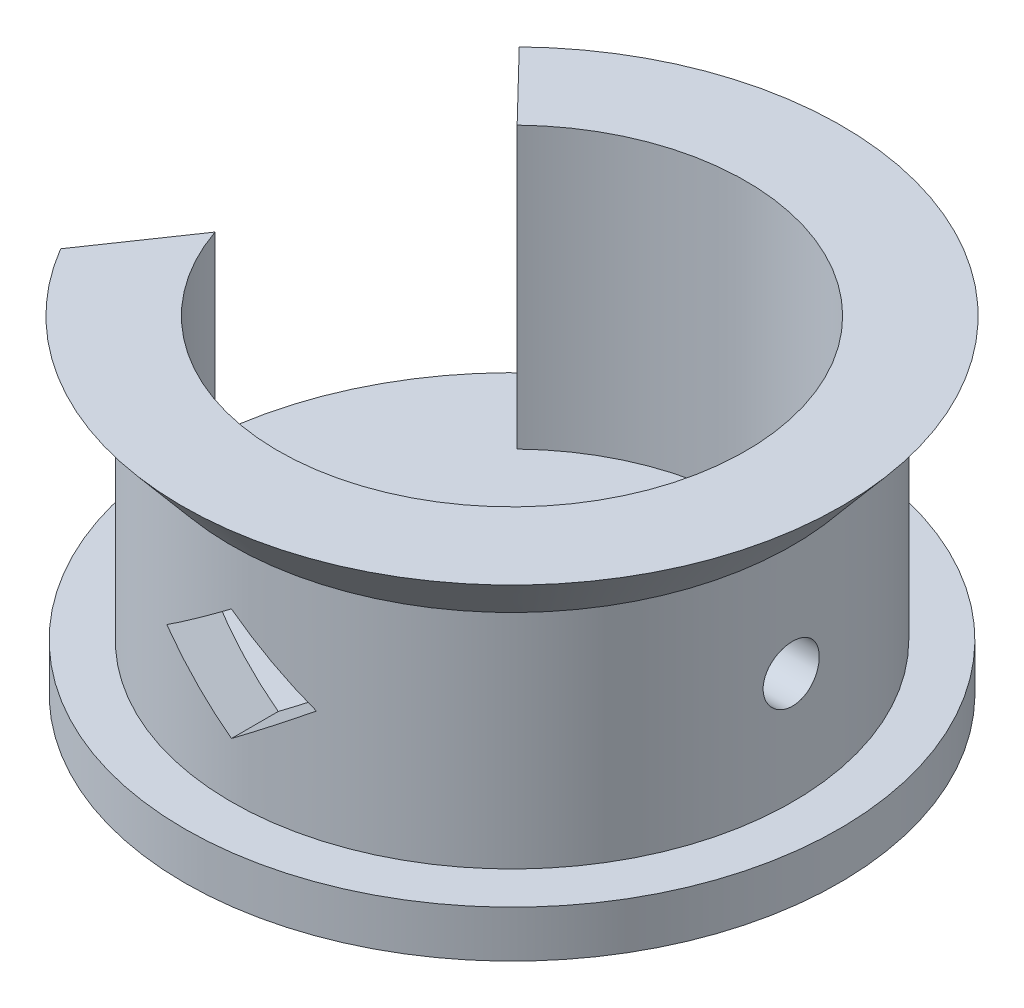
ISO-10303-21;
HEADER;
FILE_DESCRIPTION(('STEP AP214'),'2;1');
FILE_NAME('part.step','',(''),(''),'','','');
FILE_SCHEMA(('AUTOMOTIVE_DESIGN { 1 0 10303 214 1 1 1 1 }'));
ENDSEC;
DATA;
#1=APPLICATION_CONTEXT('core data for automotive mechanical design processes');
#2=APPLICATION_PROTOCOL_DEFINITION('international standard','automotive_design',2000,#1);
#3=PRODUCT_CONTEXT('',#1,'mechanical');
#4=PRODUCT('Part','Part','',(#3));
#5=PRODUCT_RELATED_PRODUCT_CATEGORY('part','',(#4));
#6=PRODUCT_DEFINITION_FORMATION('','',#4);
#7=PRODUCT_DEFINITION_CONTEXT('part definition',#1,'design');
#8=PRODUCT_DEFINITION('design','',#6,#7);
#9=PRODUCT_DEFINITION_SHAPE('','',#8);
#10=(LENGTH_UNIT() NAMED_UNIT(*) SI_UNIT(.MILLI.,.METRE.));
#11=(NAMED_UNIT(*) PLANE_ANGLE_UNIT() SI_UNIT($,.RADIAN.));
#12=(NAMED_UNIT(*) SI_UNIT($,.STERADIAN.) SOLID_ANGLE_UNIT());
#13=UNCERTAINTY_MEASURE_WITH_UNIT(LENGTH_MEASURE(1.E-05),#10,'distance_accuracy_value','');
#14=(GEOMETRIC_REPRESENTATION_CONTEXT(3) GLOBAL_UNCERTAINTY_ASSIGNED_CONTEXT((#13)) GLOBAL_UNIT_ASSIGNED_CONTEXT((#10,
#11,#12)) REPRESENTATION_CONTEXT('',''));
#15=CARTESIAN_POINT('',(0.,0.,0.));
#16=DIRECTION('',(0.,0.,1.));
#17=DIRECTION('',(1.,0.,0.));
#18=AXIS2_PLACEMENT_3D('',#15,#16,#17);
#19=CARTESIAN_POINT('',(0.,5.75,0.));
#20=DIRECTION('',(0.,-1.,0.));
#21=DIRECTION('',(0.,0.,-1.));
#22=AXIS2_PLACEMENT_3D('',#19,#20,#21);
#23=CYLINDRICAL_SURFACE('',#22,6.);
#24=CARTESIAN_POINT('',(0.,2.175,0.));
#25=DIRECTION('',(0.6,0.8,0.));
#26=DIRECTION('',(0.8,-0.6,0.));
#27=AXIS2_PLACEMENT_3D('',#24,#25,#26);
#28=ELLIPSE('',#27,7.5,6.);
#29=CARTESIAN_POINT('',(-1.6,3.375,5.78273291792039));
#30=VERTEX_POINT('',#29);
#31=CARTESIAN_POINT('',(0.,2.175,6.));
#32=VERTEX_POINT('',#31);
#33=EDGE_CURVE('E169',#30,#32,#28,.T.);
#34=ORIENTED_EDGE('',*,*,#33,.F.);
#35=CARTESIAN_POINT('',(0.,4.575,0.));
#36=DIRECTION('',(-0.6,0.8,0.));
#37=DIRECTION('',(-0.8,-0.6,0.));
#38=AXIS2_PLACEMENT_3D('',#35,#36,#37);
#39=ELLIPSE('',#38,7.5,6.);
#40=CARTESIAN_POINT('',(0.,4.575,6.));
#41=VERTEX_POINT('',#40);
#42=EDGE_CURVE('E150',#30,#41,#39,.T.);
#43=ORIENTED_EDGE('',*,*,#42,.T.);
#44=CARTESIAN_POINT('',(0.,4.575,0.));
#45=DIRECTION('',(0.6,0.8,0.));
#46=DIRECTION('',(0.8,-0.6,0.));
#47=AXIS2_PLACEMENT_3D('',#44,#45,#46);
#48=ELLIPSE('',#47,7.5,6.);
#49=CARTESIAN_POINT('',(1.6,3.375,5.78273291792039));
#50=VERTEX_POINT('',#49);
#51=EDGE_CURVE('E156',#41,#50,#48,.T.);
#52=ORIENTED_EDGE('',*,*,#51,.T.);
#53=CARTESIAN_POINT('',(0.,2.175,0.));
#54=DIRECTION('',(-0.6,0.8,0.));
#55=DIRECTION('',(-0.8,-0.6,0.));
#56=AXIS2_PLACEMENT_3D('',#53,#54,#55);
#57=ELLIPSE('',#56,7.5,6.);
#58=EDGE_CURVE('E166',#32,#50,#57,.T.);
#59=ORIENTED_EDGE('',*,*,#58,.F.);
#60=EDGE_LOOP('',(#34,#43,#52,#59));
#61=FACE_BOUND('',#60,.T.);
#62=DIRECTION('',(0.,-1.,0.));
#63=VECTOR('',#62,1.);
#64=CARTESIAN_POINT('',(-5.40419060518485,5.75,2.60666912032038));
#65=LINE('',#64,#63);
#66=CARTESIAN_POINT('',(-5.40419060518485,1.,2.60666912032038));
#67=VERTEX_POINT('',#66);
#68=CARTESIAN_POINT('',(-5.40419060518485,5.75,2.60666912032038));
#69=VERTEX_POINT('',#68);
#70=EDGE_CURVE('E245',#67,#69,#65,.F.);
#71=ORIENTED_EDGE('',*,*,#70,.F.);
#72=CARTESIAN_POINT('',(0.,1.,0.));
#73=DIRECTION('',(0.,1.,0.));
#74=DIRECTION('',(0.,0.,1.));
#75=AXIS2_PLACEMENT_3D('',#72,#73,#74);
#76=CIRCLE('',#75,6.);
#77=CARTESIAN_POINT('',(-4.17641886951736,1.,-4.30784463813858));
#78=VERTEX_POINT('',#77);
#79=EDGE_CURVE('E283',#67,#78,#76,.T.);
#80=ORIENTED_EDGE('',*,*,#79,.T.);
#81=DIRECTION('',(0.,-1.,0.));
#82=VECTOR('',#81,1.);
#83=CARTESIAN_POINT('',(-4.17641886951736,5.75,-4.30784463813858));
#84=LINE('',#83,#82);
#85=CARTESIAN_POINT('',(-4.17641886951736,5.75,-4.30784463813858));
#86=VERTEX_POINT('',#85);
#87=EDGE_CURVE('E125',#78,#86,#84,.F.);
#88=ORIENTED_EDGE('',*,*,#87,.T.);
#89=CARTESIAN_POINT('',(0.,5.75,0.));
#90=DIRECTION('',(0.,1.,0.));
#91=DIRECTION('',(0.,0.,1.));
#92=AXIS2_PLACEMENT_3D('',#89,#90,#91);
#93=CIRCLE('',#92,6.);
#94=EDGE_CURVE('E172',#69,#86,#93,.T.);
#95=ORIENTED_EDGE('',*,*,#94,.F.);
#96=EDGE_LOOP('',(#71,#80,#88,#95));
#97=FACE_BOUND('',#96,.T.);
#98=CARTESIAN_POINT('',(5.96992462263972,3.375,0.6));
#99=CARTESIAN_POINT('',(5.96992501678142,3.34138826149584,0.599998544036107));
#100=CARTESIAN_POINT('',(5.97021154196531,3.3077542989529,0.597166115389485));
#101=CARTESIAN_POINT('',(5.97132652534872,3.24141888822388,0.585909788858137));
#102=CARTESIAN_POINT('',(5.97215558076732,3.20871850917751,0.577479728931861));
#103=CARTESIAN_POINT('',(5.97426079828433,3.14522050846926,0.555276069641356));
#104=CARTESIAN_POINT('',(5.97553668928074,3.11442174636514,0.541505709776339));
#105=CARTESIAN_POINT('',(5.97839148343092,3.05557932462495,0.50901856043466));
#106=CARTESIAN_POINT('',(5.97997032638597,3.02753511930977,0.490302753375555));
#107=CARTESIAN_POINT('',(5.98325956025939,2.9748892418055,0.448382857199222));
#108=CARTESIAN_POINT('',(5.9849703600316,2.95029899429773,0.425164450864955));
#109=CARTESIAN_POINT('',(5.98832703141431,2.90535743459786,0.374929029191738));
#110=CARTESIAN_POINT('',(5.98997290005128,2.88500631635621,0.347911840143941));
#111=CARTESIAN_POINT('',(5.99301829893363,2.84908124579571,0.290775816990592));
#112=CARTESIAN_POINT('',(5.99441730536788,2.8335174007238,0.260650597517741));
#113=CARTESIAN_POINT('',(5.99680690125462,2.80767334011079,0.198197990572506));
#114=CARTESIAN_POINT('',(5.99779750066238,2.79739299577832,0.165870656800931));
#115=CARTESIAN_POINT('',(5.99925579942616,2.78244125438805,0.100046869645769));
#116=CARTESIAN_POINT('',(5.9997252470569,2.77775110035003,0.0665547162189482));
#117=CARTESIAN_POINT('',(6.00009429359215,2.77405483851977,-0.000744444413366362));
#118=CARTESIAN_POINT('',(5.99999390727164,2.77504858335224,-0.0345514434326772));
#119=CARTESIAN_POINT('',(5.99923602786711,2.78267668359009,-0.101393306438736));
#120=CARTESIAN_POINT('',(5.99858052691028,2.78929086933833,-0.134430497960988));
#121=CARTESIAN_POINT('',(5.99678837558958,2.80794067736797,-0.19892350770272));
#122=CARTESIAN_POINT('',(5.99565171897572,2.81997637007254,-0.230379305374637));
#123=CARTESIAN_POINT('',(5.99302162490349,2.84914965795266,-0.290880188807752));
#124=CARTESIAN_POINT('',(5.99152756419455,2.86629617851809,-0.31992094258899));
#125=CARTESIAN_POINT('',(5.98835030711644,2.90519791400182,-0.374720107904516));
#126=CARTESIAN_POINT('',(5.98666710520087,2.92695326408711,-0.400478423136497));
#127=CARTESIAN_POINT('',(5.98329176080711,2.97456853770819,-0.448099663093614));
#128=CARTESIAN_POINT('',(5.98159961143817,3.00044600684495,-0.469945047714207));
#129=CARTESIAN_POINT('',(5.97840443956933,3.05551011912647,-0.508984521214751));
#130=CARTESIAN_POINT('',(5.97690141734379,3.08469676707129,-0.526178603347734));
#131=CARTESIAN_POINT('',(5.9742545370849,3.14556421511988,-0.555427310743938));
#132=CARTESIAN_POINT('',(5.97311075479533,3.17724553945373,-0.567480852343776));
#133=CARTESIAN_POINT('',(5.97131341122563,3.24219636276881,-0.586092441382554));
#134=CARTESIAN_POINT('',(5.97065983501061,3.27546581333247,-0.59265065624582));
#135=CARTESIAN_POINT('',(5.9699194831645,3.34249450771771,-0.600062865235176));
#136=CARTESIAN_POINT('',(5.96983026928562,3.3762510121589,-0.600941397988327));
#137=CARTESIAN_POINT('',(5.97022230812863,3.44343075949372,-0.597033748122817));
#138=CARTESIAN_POINT('',(5.97070355314237,3.47685400688422,-0.592247642045852));
#139=CARTESIAN_POINT('',(5.97218006653441,3.54234694936701,-0.577167104704512));
#140=CARTESIAN_POINT('',(5.97317425200807,3.5744193426568,-0.566884276313345));
#141=CARTESIAN_POINT('',(5.97556374623277,3.63638403103818,-0.541114031805564));
#142=CARTESIAN_POINT('',(5.97695906417202,3.66627627617231,-0.525626496470153));
#143=CARTESIAN_POINT('',(5.97999950613428,3.72314398441727,-0.48982500085393));
#144=CARTESIAN_POINT('',(5.98164546488803,3.75010916517975,-0.469494779904414));
#145=CARTESIAN_POINT('',(5.98499899575112,3.80025303196444,-0.424608320070704));
#146=CARTESIAN_POINT('',(5.9867065693852,3.82343162420405,-0.400051976548881));
#147=CARTESIAN_POINT('',(5.98999828709581,3.86542898003886,-0.347303882535884));
#148=CARTESIAN_POINT('',(5.99158196433285,3.88423173575173,-0.319099353581671));
#149=CARTESIAN_POINT('',(5.99444065263978,3.91683352110385,-0.259918630450278));
#150=CARTESIAN_POINT('',(5.99571566793895,3.93063261930426,-0.228942474257775));
#151=CARTESIAN_POINT('',(5.99781126248403,3.9528082605932,-0.165153675859689));
#152=CARTESIAN_POINT('',(5.99863265163389,3.96119447239513,-0.132344422589975));
#153=CARTESIAN_POINT('',(5.99973176768189,3.97233784174791,-0.0657748883902072));
#154=CARTESIAN_POINT('',(6.00000950985938,3.97509515750042,-0.0320146342153302));
#155=CARTESIAN_POINT('',(5.99999002987962,3.97490024013603,0.0353413344454483));
#156=CARTESIAN_POINT('',(5.99969531026002,3.97197285789801,0.0689371243347171));
#157=CARTESIAN_POINT('',(5.99856896146555,3.96054375260581,0.135157133013818));
#158=CARTESIAN_POINT('',(5.99773733186924,3.95204202517622,0.16778135104102));
#159=CARTESIAN_POINT('',(5.99563034288377,3.92971244556424,0.231131945260646));
#160=CARTESIAN_POINT('',(5.99435504401949,3.9158853198395,0.261858579646517));
#161=CARTESIAN_POINT('',(5.99150287449778,3.88330009864981,0.320558760092878));
#162=CARTESIAN_POINT('',(5.98992600560493,3.86454203203733,0.348532322261136));
#163=CARTESIAN_POINT('',(5.98663910801433,3.82253422858575,0.401059634656163));
#164=CARTESIAN_POINT('',(5.9849285487642,3.79926599025312,0.425598555731604));
#165=CARTESIAN_POINT('',(5.98157154461795,3.74893478907273,0.470434655635885));
#166=CARTESIAN_POINT('',(5.97992511520666,3.72187091689855,0.490730815108709));
#167=CARTESIAN_POINT('',(5.97687830046361,3.66464139484805,0.526545984254432));
#168=CARTESIAN_POINT('',(5.97547855155184,3.63446803120557,0.542052712796901));
#169=CARTESIAN_POINT('',(5.97309116857477,3.57195102525226,0.567758824859261));
#170=CARTESIAN_POINT('',(5.97210306992016,3.53960987764457,0.577964194733915));
#171=CARTESIAN_POINT('',(5.97090004522887,3.48507135546053,0.590233013000118));
#172=CARTESIAN_POINT('',(5.97053599161417,3.46322264921614,0.593890627438935));
#173=CARTESIAN_POINT('',(5.97004815106598,3.41925250617447,0.598774595163068));
#174=CARTESIAN_POINT('',(5.96992436312391,3.39713107052244,0.600000958654358));
#175=CARTESIAN_POINT('',(5.96992462263972,3.375,0.6));
#176=B_SPLINE_CURVE_WITH_KNOTS('',3,(#98,#99,#100,#101,#102,#103,#104,#105,#106,#107,#108,#109,
#110,#111,#112,#113,#114,#115,#116,#117,#118,#119,#120,#121,#122,#123,#124,#125,#126,#127,#128,
#129,#130,#131,#132,#133,#134,#135,#136,#137,#138,#139,#140,#141,#142,#143,#144,#145,#146,#147,
#148,#149,#150,#151,#152,#153,#154,#155,#156,#157,#158,#159,#160,#161,#162,#163,#164,#165,#166,
#167,#168,#169,#170,#171,#172,#173,#174,#175),.UNSPECIFIED.,.T.,.F.,(4,2,2,2,2,2,2,2,2,2,2,2,2,
2,2,2,2,2,2,2,2,2,2,2,2,2,2,2,2,2,2,2,2,2,2,2,2,2,4),(0.,0.100754396661877,0.201619891093062,
0.302424294598484,0.403208688252789,0.504318969179551,0.605433875131518,0.70676081982775,
0.808085294446769,0.909068825390698,1.01004973798939,1.11066979091197,1.21129115088585,
1.31208927279848,1.41289035131117,1.51413255051001,1.61537489656538,1.7166385747076,
1.8178991675702,1.91872197784659,2.01954342580122,2.12015288822716,2.22076465536628,
2.32171913887031,2.42267612233922,2.52399682090871,2.62531613110803,2.72645395616617,
2.82758893867889,2.9282828008109,3.02897674197995,3.12965695197148,3.23033657286479,
3.33143829022793,3.43256427020715,3.53394744642286,3.635215889364,3.70155616563628,
3.76789616342289),.UNSPECIFIED.);
#177=CARTESIAN_POINT('',(5.96992462263972,3.375,0.6));
#178=VERTEX_POINT('',#177);
#179=EDGE_CURVE('E227',#178,#178,#176,.T.);
#180=ORIENTED_EDGE('',*,*,#179,.F.);
#181=EDGE_LOOP('',(#180));
#182=FACE_BOUND('',#181,.T.);
#183=ADVANCED_FACE('F45',(#61,#97,#182),#23,.T.);
#184=CARTESIAN_POINT('',(0.,5.75,0.));
#185=DIRECTION('',(0.,-1.,0.));
#186=DIRECTION('',(0.,0.,-1.));
#187=AXIS2_PLACEMENT_3D('',#184,#185,#186);
#188=CYLINDRICAL_SURFACE('',#187,5.);
#189=CARTESIAN_POINT('',(0.,1.,0.));
#190=DIRECTION('',(0.,1.,0.));
#191=DIRECTION('',(0.,0.,1.));
#192=AXIS2_PLACEMENT_3D('',#189,#190,#191);
#193=CIRCLE('',#192,5.);
#194=CARTESIAN_POINT('',(-3.48034905793113,1.,-3.58987053178215));
#195=VERTEX_POINT('',#194);
#196=CARTESIAN_POINT('',(-4.73004533541473,1.,1.62070081289587));
#197=VERTEX_POINT('',#196);
#198=EDGE_CURVE('E140',#195,#197,#193,.F.);
#199=ORIENTED_EDGE('',*,*,#198,.T.);
#200=DIRECTION('',(0.,1.,0.));
#201=VECTOR('',#200,1.);
#202=CARTESIAN_POINT('',(-4.73004533541473,1.,1.62070081289587));
#203=LINE('',#202,#201);
#204=CARTESIAN_POINT('',(-4.73004533541473,7.,1.62070081289587));
#205=VERTEX_POINT('',#204);
#206=EDGE_CURVE('E144',#197,#205,#203,.T.);
#207=ORIENTED_EDGE('',*,*,#206,.T.);
#208=CARTESIAN_POINT('',(0.,7.,0.));
#209=DIRECTION('',(0.,1.,0.));
#210=DIRECTION('',(0.,0.,1.));
#211=AXIS2_PLACEMENT_3D('',#208,#209,#210);
#212=CIRCLE('',#211,5.);
#213=CARTESIAN_POINT('',(-3.48034905793113,7.,-3.58987053178215));
#214=VERTEX_POINT('',#213);
#215=EDGE_CURVE('E142',#205,#214,#212,.T.);
#216=ORIENTED_EDGE('',*,*,#215,.T.);
#217=DIRECTION('',(0.,1.,0.));
#218=VECTOR('',#217,1.);
#219=CARTESIAN_POINT('',(-3.48034905793113,1.,-3.58987053178215));
#220=LINE('',#219,#218);
#221=EDGE_CURVE('E123',#195,#214,#220,.T.);
#222=ORIENTED_EDGE('',*,*,#221,.F.);
#223=EDGE_LOOP('',(#199,#207,#216,#222));
#224=FACE_BOUND('',#223,.T.);
#225=CARTESIAN_POINT('',(0.,4.575,0.));
#226=DIRECTION('',(-0.6,0.8,0.));
#227=DIRECTION('',(-0.8,-0.6,0.));
#228=AXIS2_PLACEMENT_3D('',#225,#226,#227);
#229=ELLIPSE('',#228,6.25,5.);
#230=CARTESIAN_POINT('',(-1.6,3.375,4.73708771293081));
#231=VERTEX_POINT('',#230);
#232=CARTESIAN_POINT('',(0.,4.575,5.));
#233=VERTEX_POINT('',#232);
#234=EDGE_CURVE('E267',#231,#233,#229,.T.);
#235=ORIENTED_EDGE('',*,*,#234,.F.);
#236=CARTESIAN_POINT('',(0.,2.175,0.));
#237=DIRECTION('',(0.6,0.8,0.));
#238=DIRECTION('',(0.8,-0.6,0.));
#239=AXIS2_PLACEMENT_3D('',#236,#237,#238);
#240=ELLIPSE('',#239,6.25,5.);
#241=CARTESIAN_POINT('',(0.,2.175,5.));
#242=VERTEX_POINT('',#241);
#243=EDGE_CURVE('E277',#231,#242,#240,.T.);
#244=ORIENTED_EDGE('',*,*,#243,.T.);
#245=CARTESIAN_POINT('',(0.,2.175,0.));
#246=DIRECTION('',(-0.6,0.8,0.));
#247=DIRECTION('',(-0.8,-0.6,0.));
#248=AXIS2_PLACEMENT_3D('',#245,#246,#247);
#249=ELLIPSE('',#248,6.25,5.);
#250=CARTESIAN_POINT('',(1.6,3.375,4.73708771293081));
#251=VERTEX_POINT('',#250);
#252=EDGE_CURVE('E273',#242,#251,#249,.T.);
#253=ORIENTED_EDGE('',*,*,#252,.T.);
#254=CARTESIAN_POINT('',(0.,4.575,0.));
#255=DIRECTION('',(0.6,0.8,0.));
#256=DIRECTION('',(0.8,-0.6,0.));
#257=AXIS2_PLACEMENT_3D('',#254,#255,#256);
#258=ELLIPSE('',#257,6.25,5.);
#259=EDGE_CURVE('E270',#233,#251,#258,.T.);
#260=ORIENTED_EDGE('',*,*,#259,.F.);
#261=EDGE_LOOP('',(#235,#244,#253,#260));
#262=FACE_BOUND('',#261,.T.);
#263=CARTESIAN_POINT('',(4.96386945839634,3.375,0.6));
#264=CARTESIAN_POINT('',(4.9638699235667,3.34142817176193,0.599998566345552));
#265=CARTESIAN_POINT('',(4.96421371576855,3.30783509597572,0.597172826992676));
#266=CARTESIAN_POINT('',(4.96555129020866,3.24158307759369,0.585944637419275));
#267=CARTESIAN_POINT('',(4.96654575971934,3.20892516086379,0.577536290478033));
#268=CARTESIAN_POINT('',(4.96907046210478,3.14551231889724,0.555393669231672));
#269=CARTESIAN_POINT('',(4.9706003397472,3.11475614777276,0.541662925579496));
#270=CARTESIAN_POINT('',(4.97402304999376,3.05599057157981,0.509272675115884));
#271=CARTESIAN_POINT('',(4.97591581835864,3.02798068168641,0.490614040424029));
#272=CARTESIAN_POINT('',(4.97986200109296,2.97535204567797,0.448794287860078));
#273=CARTESIAN_POINT('',(4.98191611633016,2.95074954113028,0.425612794501293));
#274=CARTESIAN_POINT('',(4.98594723170915,2.90577425636762,0.375449172869758));
#275=CARTESIAN_POINT('',(4.98792422807936,2.88540168281164,0.348466859010827));
#276=CARTESIAN_POINT('',(4.99158548046123,2.84940669341274,0.291365913693595));
#277=CARTESIAN_POINT('',(4.99326882761331,2.83379891685207,0.261237990769797));
#278=CARTESIAN_POINT('',(4.99614542486483,2.80787030792305,0.198765153454555));
#279=CARTESIAN_POINT('',(4.99733869178934,2.79754929405045,0.166420315217108));
#280=CARTESIAN_POINT('',(4.99909574649051,2.78253554877931,0.100597571397016));
#281=CARTESIAN_POINT('',(4.99966254728816,2.77781586931085,0.0671258942086757));
#282=CARTESIAN_POINT('',(5.00011308732203,2.7740552801379,-0.000138899333713211));
#283=CARTESIAN_POINT('',(4.99999685144069,2.77501416356836,-0.0339320039336681));
#284=CARTESIAN_POINT('',(4.99909685850532,2.78256182437027,-0.100697133503506));
#285=CARTESIAN_POINT('',(4.99831653768676,2.78912162099448,-0.133672487513643));
#286=CARTESIAN_POINT('',(4.99617992844761,2.8076396303432,-0.198050874018236));
#287=CARTESIAN_POINT('',(4.99482362980932,2.81959793883633,-0.229453878608521));
#288=CARTESIAN_POINT('',(4.99168155809107,2.8486045457813,-0.289886224651875));
#289=CARTESIAN_POINT('',(4.98989472377384,2.86566544720128,-0.318909459455077));
#290=CARTESIAN_POINT('',(4.98609161934322,2.90438377979123,-0.373691784039757));
#291=CARTESIAN_POINT('',(4.98407533953192,2.92604140528312,-0.399450735753378));
#292=CARTESIAN_POINT('',(4.98002413490592,2.97350086990809,-0.447143442246099));
#293=CARTESIAN_POINT('',(4.97798917265084,2.9993279562747,-0.469052077756758));
#294=CARTESIAN_POINT('',(4.97414252092149,3.0543063027359,-0.508227183650314));
#295=CARTESIAN_POINT('',(4.9723308320519,3.0834575718329,-0.525493641461051));
#296=CARTESIAN_POINT('',(4.96913584110431,3.14427849802948,-0.554895356717299));
#297=CARTESIAN_POINT('',(4.96775269869133,3.17594908825158,-0.567028702315283));
#298=CARTESIAN_POINT('',(4.96557456613223,3.24089847190024,-0.585798020064755));
#299=CARTESIAN_POINT('',(4.96477954993463,3.27417719402386,-0.592434235717102));
#300=CARTESIAN_POINT('',(4.96387240031274,3.34117661927534,-0.59998785742433));
#301=CARTESIAN_POINT('',(4.96375605121268,3.37489328717623,-0.600940568541544));
#302=CARTESIAN_POINT('',(4.96420826602292,3.44200575616859,-0.597193196111205));
#303=CARTESIAN_POINT('',(4.96477681650601,3.47540156353748,-0.592493223382497));
#304=CARTESIAN_POINT('',(4.96653092549957,3.5408191567196,-0.577603583884036));
#305=CARTESIAN_POINT('',(4.96771457204317,3.57284486936186,-0.567430924997875));
#306=CARTESIAN_POINT('',(4.97056395706497,3.63473585659519,-0.541902153585248));
#307=CARTESIAN_POINT('',(4.97222971121828,3.66460106090061,-0.526545872517223));
#308=CARTESIAN_POINT('',(4.97586574626598,3.72148325899492,-0.490998605443221));
#309=CARTESIAN_POINT('',(4.97783747219711,3.74848565737626,-0.470784414282952));
#310=CARTESIAN_POINT('',(4.98185871080738,3.79872702260236,-0.426128035673414));
#311=CARTESIAN_POINT('',(4.98390822626876,3.82196585468118,-0.40168569688724));
#312=CARTESIAN_POINT('',(4.98786701889821,3.86414394944698,-0.349112854533544));
#313=CARTESIAN_POINT('',(4.98977550512061,3.88306004930228,-0.320963699883566));
#314=CARTESIAN_POINT('',(4.9932254486232,3.91589564186582,-0.261867285882116));
#315=CARTESIAN_POINT('',(4.99476691280075,3.92981522847489,-0.230920079128883));
#316=CARTESIAN_POINT('',(4.99730560861028,3.95222420097516,-0.167183848943998));
#317=CARTESIAN_POINT('',(4.99830419405257,3.96072710397685,-0.134399634129437));
#318=CARTESIAN_POINT('',(4.99965022729014,3.97210534871643,-0.0678561169982956));
#319=CARTESIAN_POINT('',(4.99999770203132,3.97498092333863,-0.0340968550922521));
#320=CARTESIAN_POINT('',(5.00000226097294,3.97501876882246,0.033212001251132));
#321=CARTESIAN_POINT('',(4.99966366730498,3.97221680733664,0.0667615809317745));
#322=CARTESIAN_POINT('',(4.99834270804142,3.9610547090195,0.132909444959247));
#323=CARTESIAN_POINT('',(4.99736034265685,3.9526945740101,0.165507729617898));
#324=CARTESIAN_POINT('',(4.99486176038979,3.93066439697368,0.228823911196723));
#325=CARTESIAN_POINT('',(4.99334570158299,3.9169959271091,0.259542361749599));
#326=CARTESIAN_POINT('',(4.98994784886322,3.88474078608312,0.318255082105062));
#327=CARTESIAN_POINT('',(4.98806605199043,3.86615407511943,0.34624932985874));
#328=CARTESIAN_POINT('',(4.98413278724527,3.82445726359875,0.398901896849716));
#329=CARTESIAN_POINT('',(4.98208036352183,3.80132052893485,0.423539053575359));
#330=CARTESIAN_POINT('',(4.97804493729182,3.75123539256951,0.468595461424817));
#331=CARTESIAN_POINT('',(4.97606195138489,3.72428608709974,0.489013709626173));
#332=CARTESIAN_POINT('',(4.97238238415055,3.6672314127659,0.525114149457491));
#333=CARTESIAN_POINT('',(4.97068684912818,3.63711513434541,0.540779196400619));
#334=CARTESIAN_POINT('',(4.96778644753479,3.57467644924984,0.566807611647488));
#335=CARTESIAN_POINT('',(4.96658104327924,3.54235650576045,0.57717679285206));
#336=CARTESIAN_POINT('',(4.96509254473976,3.48738809217892,0.589814020147281));
#337=CARTESIAN_POINT('',(4.96463614619901,3.46508744960802,0.593628329883895));
#338=CARTESIAN_POINT('',(4.9640244474611,3.42019441357315,0.598721793819022));
#339=CARTESIAN_POINT('',(4.96386914522333,3.39760202208748,0.600000965198835));
#340=CARTESIAN_POINT('',(4.96386945839634,3.375,0.6));
#341=B_SPLINE_CURVE_WITH_KNOTS('',3,(#263,#264,#265,#266,#267,#268,#269,#270,#271,#272,#273,
#274,#275,#276,#277,#278,#279,#280,#281,#282,#283,#284,#285,#286,#287,#288,#289,#290,#291,#292,
#293,#294,#295,#296,#297,#298,#299,#300,#301,#302,#303,#304,#305,#306,#307,#308,#309,#310,#311,
#312,#313,#314,#315,#316,#317,#318,#319,#320,#321,#322,#323,#324,#325,#326,#327,#328,#329,#330,
#331,#332,#333,#334,#335,#336,#337,#338,#339,#340),.UNSPECIFIED.,.T.,.F.,(4,2,2,2,2,2,2,2,2,2,2,
2,2,2,2,2,2,2,2,2,2,2,2,2,2,2,2,2,2,2,2,2,2,2,2,2,2,2,4),(0.,0.100632922643844,
0.201372309927725,0.302044985008905,0.402699855344441,0.503819106641508,0.604943297094443,
0.706375123507079,0.807803467345789,0.908741834432208,1.00967652444525,1.11009209231738,
1.21050944161334,1.31117689071054,1.41184859627167,1.51315448881769,1.61446065572223,
1.71580452135318,1.81714389761633,1.91785310817259,2.018560344393,2.11895639793242,
2.21935571608811,2.32024450062123,2.42113689698587,2.52255785859056,2.62397691406367,
2.72514188068195,2.82630266054771,2.9268281237563,3.02735355401375,3.12784923446599,
3.2283457282335,3.32944900824762,3.43057629503645,3.53206412432329,3.63344031682385,
3.70119125785949,3.76894173972763),.UNSPECIFIED.);
#342=CARTESIAN_POINT('',(4.96386945839634,3.375,0.6));
#343=VERTEX_POINT('',#342);
#344=EDGE_CURVE('E49',#343,#343,#341,.T.);
#345=ORIENTED_EDGE('',*,*,#344,.T.);
#346=EDGE_LOOP('',(#345));
#347=FACE_BOUND('',#346,.T.);
#348=ADVANCED_FACE('F137',(#224,#262,#347),#188,.F.);
#349=CARTESIAN_POINT('',(0.,7.,0.));
#350=DIRECTION('',(0.,1.,0.));
#351=DIRECTION('',(0.,0.,1.));
#352=AXIS2_PLACEMENT_3D('',#349,#350,#351);
#353=PLANE('',#352);
#354=ORIENTED_EDGE('',*,*,#215,.F.);
#355=DIRECTION('',(-0.564418925597191,0.,0.825488507750237));
#356=VECTOR('',#355,1.);
#357=CARTESIAN_POINT('',(-2.46808174143914,7.,-1.68752445577426));
#358=LINE('',#357,#356);
#359=CARTESIAN_POINT('',(-6.07097894102737,7.,3.58187757520611));
#360=VERTEX_POINT('',#359);
#361=EDGE_CURVE('E132',#205,#360,#358,.T.);
#362=ORIENTED_EDGE('',*,*,#361,.T.);
#363=CARTESIAN_POINT('',(0.,7.,0.));
#364=DIRECTION('',(0.,-1.,0.));
#365=DIRECTION('',(0.,0.,-1.));
#366=AXIS2_PLACEMENT_3D('',#363,#364,#365);
#367=CIRCLE('',#366,7.04887453897161);
#368=CARTESIAN_POINT('',(-4.90650877223692,7.,-5.06090939793674));
#369=VERTEX_POINT('',#368);
#370=EDGE_CURVE('E180',#369,#360,#367,.T.);
#371=ORIENTED_EDGE('',*,*,#370,.F.);
#372=DIRECTION('',(-0.696069811586227,0.,-0.71797410635643));
#373=VECTOR('',#372,1.);
#374=CARTESIAN_POINT('',(0.,7.,0.));
#375=LINE('',#374,#373);
#376=EDGE_CURVE('E67',#214,#369,#375,.T.);
#377=ORIENTED_EDGE('',*,*,#376,.F.);
#378=EDGE_LOOP('',(#354,#362,#371,#377));
#379=FACE_BOUND('',#378,.T.);
#380=ADVANCED_FACE('F219',(#379),#353,.T.);
#381=CARTESIAN_POINT('',(0.,7.,0.));
#382=DIRECTION('',(0.,1.,0.));
#383=DIRECTION('',(0.,0.,1.));
#384=AXIS2_PLACEMENT_3D('',#381,#382,#383);
#385=CONICAL_SURFACE('',#384,7.04887453897161,0.698131700797736);
#386=CARTESIAN_POINT('',(-5.40408135359552,5.74980000000018,2.60650933487139));
#387=CARTESIAN_POINT('',(-5.46035967521203,5.8528308374435,2.6888189556566));
#388=CARTESIAN_POINT('',(-5.51643368946077,5.95621083201673,2.77082976756688));
#389=CARTESIAN_POINT('',(-5.6282191357901,6.16357875625857,2.93432109837397));
#390=CARTESIAN_POINT('',(-5.68393057839927,6.26756666810615,3.0158016326693));
#391=CARTESIAN_POINT('',(-5.79503982085093,6.47606537278013,3.17830398436072));
#392=CARTESIAN_POINT('',(-5.8504376227844,6.58057616211187,3.25932580481493));
#393=CARTESIAN_POINT('',(-5.96095815278763,6.79005911062497,3.42096713760972));
#394=CARTESIAN_POINT('',(-6.01608087279734,6.89503128315761,3.50158663816209));
#395=CARTESIAN_POINT('',(-6.07108353663259,7.00019999999998,3.58203055106528));
#396=B_SPLINE_CURVE_WITH_KNOTS('',3,(#386,#387,#388,#389,#390,#391,#392,#393,#394,#395),
.UNSPECIFIED.,.F.,.F.,(4,2,2,2,4),(0.,0.430134286923613,0.860256027114606,1.29037489640516,
1.7205062952913),.UNSPECIFIED.);
#397=EDGE_CURVE('E11',#69,#360,#396,.T.);
#398=ORIENTED_EDGE('',*,*,#397,.F.);
#399=ORIENTED_EDGE('',*,*,#94,.T.);
#400=DIRECTION('',(-0.447425050364473,0.766044443118975,-0.461504859641681));
#401=VECTOR('',#400,1.);
#402=CARTESIAN_POINT('',(0.,-1.4005215555652,0.));
#403=LINE('',#402,#401);
#404=EDGE_CURVE('E60',#86,#369,#403,.T.);
#405=ORIENTED_EDGE('',*,*,#404,.T.);
#406=ORIENTED_EDGE('',*,*,#370,.T.);
#407=EDGE_LOOP('',(#398,#399,#405,#406));
#408=FACE_BOUND('',#407,.T.);
#409=ADVANCED_FACE('F189',(#408),#385,.T.);
#410=CARTESIAN_POINT('',(0.,1.,0.));
#411=DIRECTION('',(0.,-1.,0.));
#412=DIRECTION('',(0.,0.,-1.));
#413=AXIS2_PLACEMENT_3D('',#410,#411,#412);
#414=CYLINDRICAL_SURFACE('',#413,7.);
#415=CARTESIAN_POINT('',(0.,1.,0.));
#416=DIRECTION('',(0.,1.,0.));
#417=DIRECTION('',(0.,0.,1.));
#418=AXIS2_PLACEMENT_3D('',#415,#416,#417);
#419=CIRCLE('',#418,7.);
#420=CARTESIAN_POINT('',(0.,1.,7.));
#421=VERTEX_POINT('',#420);
#422=EDGE_CURVE('E151',#421,#421,#419,.T.);
#423=ORIENTED_EDGE('',*,*,#422,.F.);
#424=EDGE_LOOP('',(#423));
#425=FACE_BOUND('',#424,.T.);
#426=CARTESIAN_POINT('',(0.,0.,0.));
#427=DIRECTION('',(0.,1.,0.));
#428=DIRECTION('',(0.,0.,1.));
#429=AXIS2_PLACEMENT_3D('',#426,#427,#428);
#430=CIRCLE('',#429,7.);
#431=CARTESIAN_POINT('',(0.,0.,7.));
#432=VERTEX_POINT('',#431);
#433=EDGE_CURVE('E159',#432,#432,#430,.T.);
#434=ORIENTED_EDGE('',*,*,#433,.T.);
#435=EDGE_LOOP('',(#434));
#436=FACE_BOUND('',#435,.T.);
#437=ADVANCED_FACE('F47',(#425,#436),#414,.T.);
#438=CARTESIAN_POINT('',(0.,1.,0.));
#439=DIRECTION('',(0.,1.,0.));
#440=DIRECTION('',(0.,0.,1.));
#441=AXIS2_PLACEMENT_3D('',#438,#439,#440);
#442=PLANE('',#441);
#443=ORIENTED_EDGE('',*,*,#422,.T.);
#444=EDGE_LOOP('',(#443));
#445=FACE_BOUND('',#444,.T.);
#446=ORIENTED_EDGE('',*,*,#79,.F.);
#447=DIRECTION('',(-0.564418925597191,0.,0.825488507750237));
#448=VECTOR('',#447,1.);
#449=CARTESIAN_POINT('',(-2.46808174143914,1.,-1.68752445577426));
#450=LINE('',#449,#448);
#451=EDGE_CURVE('E131',#197,#67,#450,.T.);
#452=ORIENTED_EDGE('',*,*,#451,.F.);
#453=ORIENTED_EDGE('',*,*,#198,.F.);
#454=DIRECTION('',(-0.696069811586227,0.,-0.71797410635643));
#455=VECTOR('',#454,1.);
#456=CARTESIAN_POINT('',(0.,1.,0.));
#457=LINE('',#456,#455);
#458=EDGE_CURVE('E120',#195,#78,#457,.T.);
#459=ORIENTED_EDGE('',*,*,#458,.T.);
#460=EDGE_LOOP('',(#446,#452,#453,#459));
#461=FACE_BOUND('',#460,.T.);
#462=CARTESIAN_POINT('',(0.,1.,0.));
#463=DIRECTION('',(0.,1.,0.));
#464=DIRECTION('',(0.,0.,1.));
#465=AXIS2_PLACEMENT_3D('',#462,#463,#464);
#466=CIRCLE('',#465,2.4);
#467=CARTESIAN_POINT('',(0.,1.,2.4));
#468=VERTEX_POINT('',#467);
#469=EDGE_CURVE('E181',#468,#468,#466,.T.);
#470=ORIENTED_EDGE('',*,*,#469,.F.);
#471=EDGE_LOOP('',(#470));
#472=FACE_BOUND('',#471,.T.);
#473=ADVANCED_FACE('F147',(#445,#461,#472),#442,.T.);
#474=CARTESIAN_POINT('',(0.,0.,0.));
#475=DIRECTION('',(0.,1.,0.));
#476=DIRECTION('',(0.,0.,1.));
#477=AXIS2_PLACEMENT_3D('',#474,#475,#476);
#478=PLANE('',#477);
#479=CARTESIAN_POINT('',(0.,0.,0.));
#480=DIRECTION('',(0.,1.,0.));
#481=DIRECTION('',(0.,0.,1.));
#482=AXIS2_PLACEMENT_3D('',#479,#480,#481);
#483=CIRCLE('',#482,2.4);
#484=CARTESIAN_POINT('',(0.,0.,2.4));
#485=VERTEX_POINT('',#484);
#486=EDGE_CURVE('E176',#485,#485,#483,.T.);
#487=ORIENTED_EDGE('',*,*,#486,.T.);
#488=EDGE_LOOP('',(#487));
#489=FACE_BOUND('',#488,.T.);
#490=ORIENTED_EDGE('',*,*,#433,.F.);
#491=EDGE_LOOP('',(#490));
#492=FACE_BOUND('',#491,.T.);
#493=ADVANCED_FACE('F291',(#489,#492),#478,.F.);
#494=CARTESIAN_POINT('',(1.044,1.392,10.));
#495=DIRECTION('',(0.6,0.8,0.));
#496=DIRECTION('',(-0.8,0.6,0.));
#497=AXIS2_PLACEMENT_3D('',#494,#495,#496);
#498=PLANE('',#497);
#499=DIRECTION('',(0.,0.,-1.));
#500=VECTOR('',#499,1.);
#501=CARTESIAN_POINT('',(-1.6,3.375,10.));
#502=LINE('',#501,#500);
#503=EDGE_CURVE('E75',#30,#231,#502,.T.);
#504=ORIENTED_EDGE('',*,*,#503,.F.);
#505=ORIENTED_EDGE('',*,*,#33,.T.);
#506=DIRECTION('',(0.,0.,-1.));
#507=VECTOR('',#506,1.);
#508=CARTESIAN_POINT('',(0.,2.175,10.));
#509=LINE('',#508,#507);
#510=EDGE_CURVE('E263',#32,#242,#509,.T.);
#511=ORIENTED_EDGE('',*,*,#510,.T.);
#512=ORIENTED_EDGE('',*,*,#243,.F.);
#513=EDGE_LOOP('',(#504,#505,#511,#512));
#514=FACE_BOUND('',#513,.T.);
#515=ADVANCED_FACE('F292',(#514),#498,.T.);
#516=CARTESIAN_POINT('',(-1.044,1.392,10.));
#517=DIRECTION('',(-0.6,0.8,0.));
#518=DIRECTION('',(-0.8,-0.6,0.));
#519=AXIS2_PLACEMENT_3D('',#516,#517,#518);
#520=PLANE('',#519);
#521=ORIENTED_EDGE('',*,*,#510,.F.);
#522=ORIENTED_EDGE('',*,*,#58,.T.);
#523=DIRECTION('',(0.,0.,-1.));
#524=VECTOR('',#523,1.);
#525=CARTESIAN_POINT('',(1.6,3.375,10.));
#526=LINE('',#525,#524);
#527=EDGE_CURVE('E259',#50,#251,#526,.T.);
#528=ORIENTED_EDGE('',*,*,#527,.T.);
#529=ORIENTED_EDGE('',*,*,#252,.F.);
#530=EDGE_LOOP('',(#521,#522,#528,#529));
#531=FACE_BOUND('',#530,.T.);
#532=ADVANCED_FACE('F297',(#531),#520,.T.);
#533=CARTESIAN_POINT('',(2.196,2.928,10.));
#534=DIRECTION('',(0.6,0.8,0.));
#535=DIRECTION('',(-0.8,0.6,0.));
#536=AXIS2_PLACEMENT_3D('',#533,#534,#535);
#537=PLANE('',#536);
#538=ORIENTED_EDGE('',*,*,#259,.T.);
#539=ORIENTED_EDGE('',*,*,#527,.F.);
#540=ORIENTED_EDGE('',*,*,#51,.F.);
#541=DIRECTION('',(0.,0.,-1.));
#542=VECTOR('',#541,1.);
#543=CARTESIAN_POINT('',(0.,4.575,10.));
#544=LINE('',#543,#542);
#545=EDGE_CURVE('E255',#41,#233,#544,.T.);
#546=ORIENTED_EDGE('',*,*,#545,.T.);
#547=EDGE_LOOP('',(#538,#539,#540,#546));
#548=FACE_BOUND('',#547,.T.);
#549=ADVANCED_FACE('F210',(#548),#537,.F.);
#550=CARTESIAN_POINT('',(-2.196,2.928,10.));
#551=DIRECTION('',(-0.6,0.8,0.));
#552=DIRECTION('',(-0.8,-0.6,0.));
#553=AXIS2_PLACEMENT_3D('',#550,#551,#552);
#554=PLANE('',#553);
#555=ORIENTED_EDGE('',*,*,#234,.T.);
#556=ORIENTED_EDGE('',*,*,#545,.F.);
#557=ORIENTED_EDGE('',*,*,#42,.F.);
#558=ORIENTED_EDGE('',*,*,#503,.T.);
#559=EDGE_LOOP('',(#555,#556,#557,#558));
#560=FACE_BOUND('',#559,.T.);
#561=ADVANCED_FACE('F203',(#560),#554,.F.);
#562=CARTESIAN_POINT('',(0.,-9.,0.));
#563=DIRECTION('',(0.,1.,0.));
#564=DIRECTION('',(0.,0.,1.));
#565=AXIS2_PLACEMENT_3D('',#562,#563,#564);
#566=CYLINDRICAL_SURFACE('',#565,2.4);
#567=ORIENTED_EDGE('',*,*,#469,.T.);
#568=EDGE_LOOP('',(#567));
#569=FACE_BOUND('',#568,.T.);
#570=ORIENTED_EDGE('',*,*,#486,.F.);
#571=EDGE_LOOP('',(#570));
#572=FACE_BOUND('',#571,.T.);
#573=ADVANCED_FACE('F197',(#569,#572),#566,.F.);
#574=CARTESIAN_POINT('',(-2.46808174143914,1.,-1.68752445577426));
#575=DIRECTION('',(-0.825488507750237,0.,-0.564418925597191));
#576=DIRECTION('',(-0.564418925597191,0.,0.825488507750237));
#577=AXIS2_PLACEMENT_3D('',#574,#575,#576);
#578=PLANE('',#577);
#579=ORIENTED_EDGE('',*,*,#70,.T.);
#580=ORIENTED_EDGE('',*,*,#397,.T.);
#581=ORIENTED_EDGE('',*,*,#361,.F.);
#582=ORIENTED_EDGE('',*,*,#206,.F.);
#583=ORIENTED_EDGE('',*,*,#451,.T.);
#584=EDGE_LOOP('',(#579,#580,#581,#582,#583));
#585=FACE_BOUND('',#584,.T.);
#586=ADVANCED_FACE('F193',(#585),#578,.T.);
#587=CARTESIAN_POINT('',(0.,1.,0.));
#588=DIRECTION('',(0.71797410635643,0.,-0.696069811586227));
#589=DIRECTION('',(-0.696069811586227,0.,-0.71797410635643));
#590=AXIS2_PLACEMENT_3D('',#587,#588,#589);
#591=PLANE('',#590);
#592=ORIENTED_EDGE('',*,*,#458,.F.);
#593=ORIENTED_EDGE('',*,*,#221,.T.);
#594=ORIENTED_EDGE('',*,*,#376,.T.);
#595=ORIENTED_EDGE('',*,*,#404,.F.);
#596=ORIENTED_EDGE('',*,*,#87,.F.);
#597=EDGE_LOOP('',(#592,#593,#594,#595,#596));
#598=FACE_BOUND('',#597,.T.);
#599=ADVANCED_FACE('F122',(#598),#591,.F.);
#600=CARTESIAN_POINT('',(10.,3.375,0.));
#601=DIRECTION('',(-1.,0.,0.));
#602=DIRECTION('',(0.,0.,1.));
#603=AXIS2_PLACEMENT_3D('',#600,#601,#602);
#604=CYLINDRICAL_SURFACE('',#603,0.6);
#605=ORIENTED_EDGE('',*,*,#344,.F.);
#606=EDGE_LOOP('',(#605));
#607=FACE_BOUND('',#606,.T.);
#608=ORIENTED_EDGE('',*,*,#179,.T.);
#609=EDGE_LOOP('',(#608));
#610=FACE_BOUND('',#609,.T.);
#611=ADVANCED_FACE('F199',(#607,#610),#604,.F.);
#612=CLOSED_SHELL('',(#183,#348,#380,#409,#437,#473,#493,#515,#532,#549,#561,#573,#586,#599,#611));
#613=MANIFOLD_SOLID_BREP('B2',#612);
#614=ADVANCED_BREP_SHAPE_REPRESENTATION('',(#18,#613),#14);
#615=SHAPE_DEFINITION_REPRESENTATION(#9,#614);
ENDSEC;
END-ISO-10303-21;
